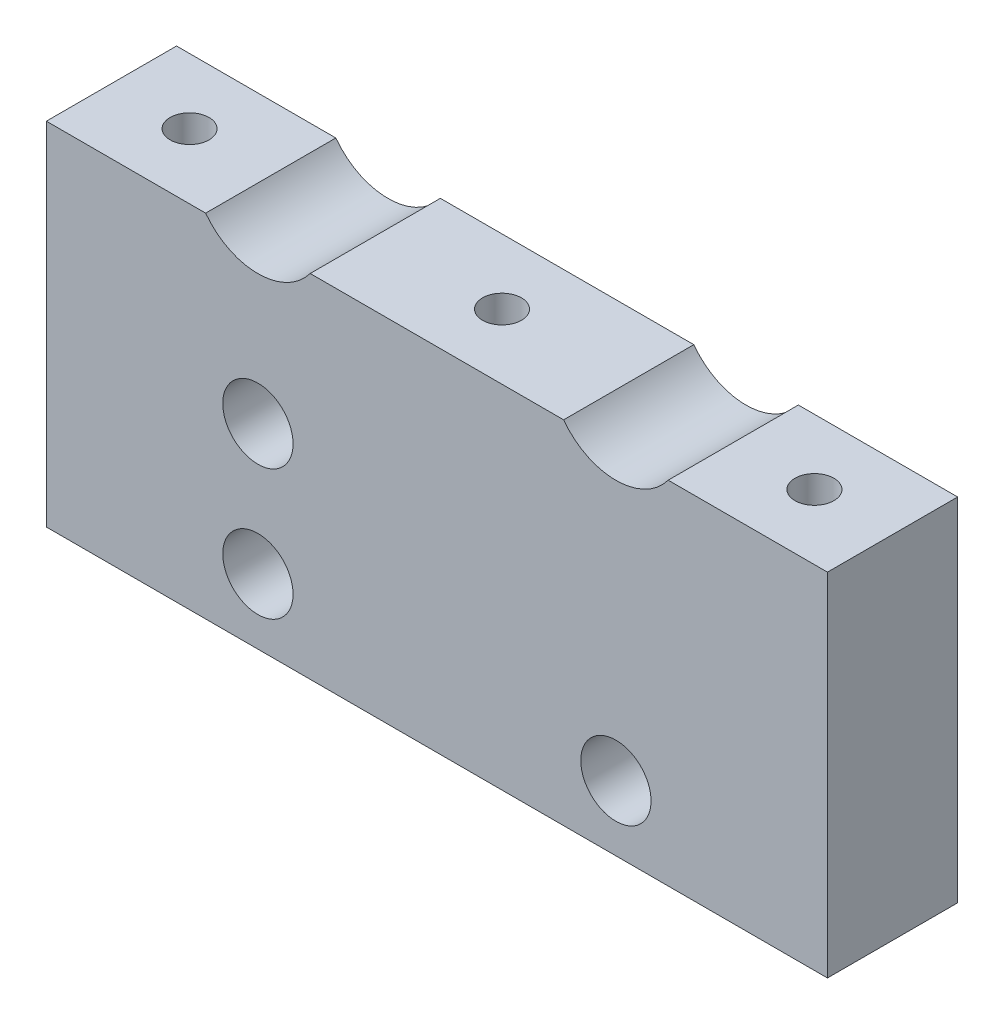
ISO-10303-21;
HEADER;
FILE_DESCRIPTION(('STEP AP214'),'2;1');
FILE_NAME('part.step','',(''),(''),'','','');
FILE_SCHEMA(('AUTOMOTIVE_DESIGN { 1 0 10303 214 1 1 1 1 }'));
ENDSEC;
DATA;
#1=APPLICATION_CONTEXT('core data for automotive mechanical design processes');
#2=APPLICATION_PROTOCOL_DEFINITION('international standard','automotive_design',2000,#1);
#3=PRODUCT_CONTEXT('',#1,'mechanical');
#4=PRODUCT('Part','Part','',(#3));
#5=PRODUCT_RELATED_PRODUCT_CATEGORY('part','',(#4));
#6=PRODUCT_DEFINITION_FORMATION('','',#4);
#7=PRODUCT_DEFINITION_CONTEXT('part definition',#1,'design');
#8=PRODUCT_DEFINITION('design','',#6,#7);
#9=PRODUCT_DEFINITION_SHAPE('','',#8);
#10=(LENGTH_UNIT() NAMED_UNIT(*) SI_UNIT(.MILLI.,.METRE.));
#11=(NAMED_UNIT(*) PLANE_ANGLE_UNIT() SI_UNIT($,.RADIAN.));
#12=(NAMED_UNIT(*) SI_UNIT($,.STERADIAN.) SOLID_ANGLE_UNIT());
#13=UNCERTAINTY_MEASURE_WITH_UNIT(LENGTH_MEASURE(1.E-05),#10,'distance_accuracy_value','');
#14=(GEOMETRIC_REPRESENTATION_CONTEXT(3) GLOBAL_UNCERTAINTY_ASSIGNED_CONTEXT((#13)) GLOBAL_UNIT_ASSIGNED_CONTEXT((#10,
#11,#12)) REPRESENTATION_CONTEXT('',''));
#15=CARTESIAN_POINT('',(0.,0.,0.));
#16=DIRECTION('',(0.,0.,1.));
#17=DIRECTION('',(1.,0.,0.));
#18=AXIS2_PLACEMENT_3D('',#15,#16,#17);
#19=CARTESIAN_POINT('',(-17.4625,20.9296,12.7));
#20=DIRECTION('',(0.,0.,1.));
#21=DIRECTION('',(1.,0.,0.));
#22=AXIS2_PLACEMENT_3D('',#19,#20,#21);
#23=PLANE('',#22);
#24=CARTESIAN_POINT('',(17.4625,-10.795,12.7));
#25=DIRECTION('',(0.,0.,1.));
#26=DIRECTION('',(-1.,0.,0.));
#27=AXIS2_PLACEMENT_3D('',#24,#25,#26);
#28=CIRCLE('',#27,3.429);
#29=CARTESIAN_POINT('',(14.0335,-10.795,12.7));
#30=VERTEX_POINT('',#29);
#31=EDGE_CURVE('E227',#30,#30,#28,.T.);
#32=ORIENTED_EDGE('',*,*,#31,.F.);
#33=EDGE_LOOP('',(#32));
#34=FACE_BOUND('',#33,.T.);
#35=DIRECTION('',(-1.,0.,0.));
#36=VECTOR('',#35,1.);
#37=CARTESIAN_POINT('',(22.5614511509721,17.145,12.7));
#38=LINE('',#37,#36);
#39=CARTESIAN_POINT('',(38.1,17.145,12.7));
#40=VERTEX_POINT('',#39);
#41=CARTESIAN_POINT('',(22.5614511509721,17.145,12.7));
#42=VERTEX_POINT('',#41);
#43=EDGE_CURVE('E178',#40,#42,#38,.T.);
#44=ORIENTED_EDGE('',*,*,#43,.T.);
#45=CARTESIAN_POINT('',(17.4625,20.9296,12.7));
#46=DIRECTION('',(0.,0.,-1.));
#47=DIRECTION('',(-1.,0.,0.));
#48=AXIS2_PLACEMENT_3D('',#45,#46,#47);
#49=CIRCLE('',#48,6.35);
#50=CARTESIAN_POINT('',(12.3635488490279,17.145,12.7));
#51=VERTEX_POINT('',#50);
#52=EDGE_CURVE('E112',#42,#51,#49,.T.);
#53=ORIENTED_EDGE('',*,*,#52,.T.);
#54=DIRECTION('',(-1.,0.,0.));
#55=VECTOR('',#54,1.);
#56=CARTESIAN_POINT('',(-12.3635488490279,17.145,12.7));
#57=LINE('',#56,#55);
#58=CARTESIAN_POINT('',(-12.3635488490279,17.145,12.7));
#59=VERTEX_POINT('',#58);
#60=EDGE_CURVE('E199',#51,#59,#57,.T.);
#61=ORIENTED_EDGE('',*,*,#60,.T.);
#62=CARTESIAN_POINT('',(-17.4625,20.9296,12.7));
#63=DIRECTION('',(0.,0.,-1.));
#64=DIRECTION('',(1.,0.,0.));
#65=AXIS2_PLACEMENT_3D('',#62,#63,#64);
#66=CIRCLE('',#65,6.35);
#67=CARTESIAN_POINT('',(-22.5614511509721,17.145,12.7));
#68=VERTEX_POINT('',#67);
#69=EDGE_CURVE('E213',#59,#68,#66,.T.);
#70=ORIENTED_EDGE('',*,*,#69,.T.);
#71=DIRECTION('',(-1.,0.,0.));
#72=VECTOR('',#71,1.);
#73=CARTESIAN_POINT('',(-38.1,17.145,12.7));
#74=LINE('',#73,#72);
#75=CARTESIAN_POINT('',(-38.1,17.145,12.7));
#76=VERTEX_POINT('',#75);
#77=EDGE_CURVE('E133',#68,#76,#74,.T.);
#78=ORIENTED_EDGE('',*,*,#77,.T.);
#79=DIRECTION('',(0.,-1.,0.));
#80=VECTOR('',#79,1.);
#81=CARTESIAN_POINT('',(-38.1,-17.145,12.7));
#82=LINE('',#81,#80);
#83=CARTESIAN_POINT('',(-38.1,-17.145,12.7));
#84=VERTEX_POINT('',#83);
#85=EDGE_CURVE('E127',#76,#84,#82,.T.);
#86=ORIENTED_EDGE('',*,*,#85,.T.);
#87=DIRECTION('',(1.,0.,0.));
#88=VECTOR('',#87,1.);
#89=CARTESIAN_POINT('',(-38.1,-17.145,12.7));
#90=LINE('',#89,#88);
#91=CARTESIAN_POINT('',(38.1,-17.145,12.7));
#92=VERTEX_POINT('',#91);
#93=EDGE_CURVE('E131',#84,#92,#90,.T.);
#94=ORIENTED_EDGE('',*,*,#93,.T.);
#95=DIRECTION('',(0.,1.,0.));
#96=VECTOR('',#95,1.);
#97=CARTESIAN_POINT('',(38.1,-17.145,12.7));
#98=LINE('',#97,#96);
#99=EDGE_CURVE('E68',#92,#40,#98,.T.);
#100=ORIENTED_EDGE('',*,*,#99,.T.);
#101=EDGE_LOOP('',(#44,#53,#61,#70,#78,#86,#94,#100));
#102=FACE_BOUND('',#101,.T.);
#103=CARTESIAN_POINT('',(-17.4625,-10.795,12.7));
#104=DIRECTION('',(0.,0.,1.));
#105=DIRECTION('',(1.,0.,0.));
#106=AXIS2_PLACEMENT_3D('',#103,#104,#105);
#107=CIRCLE('',#106,3.429);
#108=CARTESIAN_POINT('',(-14.0335,-10.795,12.7));
#109=VERTEX_POINT('',#108);
#110=EDGE_CURVE('E160',#109,#109,#107,.T.);
#111=ORIENTED_EDGE('',*,*,#110,.F.);
#112=EDGE_LOOP('',(#111));
#113=FACE_BOUND('',#112,.T.);
#114=CARTESIAN_POINT('',(-17.4625,1.905,12.7));
#115=DIRECTION('',(0.,0.,1.));
#116=DIRECTION('',(1.,0.,0.));
#117=AXIS2_PLACEMENT_3D('',#114,#115,#116);
#118=CIRCLE('',#117,3.429);
#119=CARTESIAN_POINT('',(-14.0335,1.905,12.7));
#120=VERTEX_POINT('',#119);
#121=EDGE_CURVE('E235',#120,#120,#118,.T.);
#122=ORIENTED_EDGE('',*,*,#121,.F.);
#123=EDGE_LOOP('',(#122));
#124=FACE_BOUND('',#123,.T.);
#125=ADVANCED_FACE('F50',(#34,#102,#113,#124),#23,.T.);
#126=CARTESIAN_POINT('',(-17.4625,20.9296,0.));
#127=DIRECTION('',(0.,0.,1.));
#128=DIRECTION('',(1.,0.,0.));
#129=AXIS2_PLACEMENT_3D('',#126,#127,#128);
#130=PLANE('',#129);
#131=DIRECTION('',(-1.,0.,0.));
#132=VECTOR('',#131,1.);
#133=CARTESIAN_POINT('',(22.5614511509721,17.145,0.));
#134=LINE('',#133,#132);
#135=CARTESIAN_POINT('',(38.1,17.145,0.));
#136=VERTEX_POINT('',#135);
#137=CARTESIAN_POINT('',(22.5614511509721,17.145,0.));
#138=VERTEX_POINT('',#137);
#139=EDGE_CURVE('E155',#136,#138,#134,.T.);
#140=ORIENTED_EDGE('',*,*,#139,.F.);
#141=DIRECTION('',(0.,1.,0.));
#142=VECTOR('',#141,1.);
#143=CARTESIAN_POINT('',(38.1,-17.145,0.));
#144=LINE('',#143,#142);
#145=CARTESIAN_POINT('',(38.1,-17.145,0.));
#146=VERTEX_POINT('',#145);
#147=EDGE_CURVE('E104',#146,#136,#144,.T.);
#148=ORIENTED_EDGE('',*,*,#147,.F.);
#149=DIRECTION('',(1.,0.,0.));
#150=VECTOR('',#149,1.);
#151=CARTESIAN_POINT('',(-38.1,-17.145,0.));
#152=LINE('',#151,#150);
#153=CARTESIAN_POINT('',(-38.1,-17.145,0.));
#154=VERTEX_POINT('',#153);
#155=EDGE_CURVE('E98',#154,#146,#152,.T.);
#156=ORIENTED_EDGE('',*,*,#155,.F.);
#157=DIRECTION('',(0.,-1.,0.));
#158=VECTOR('',#157,1.);
#159=CARTESIAN_POINT('',(-38.1,-17.145,0.));
#160=LINE('',#159,#158);
#161=CARTESIAN_POINT('',(-38.1,17.145,0.));
#162=VERTEX_POINT('',#161);
#163=EDGE_CURVE('E142',#162,#154,#160,.T.);
#164=ORIENTED_EDGE('',*,*,#163,.F.);
#165=DIRECTION('',(-1.,0.,0.));
#166=VECTOR('',#165,1.);
#167=CARTESIAN_POINT('',(-38.1,17.145,0.));
#168=LINE('',#167,#166);
#169=CARTESIAN_POINT('',(-22.5614511509721,17.145,0.));
#170=VERTEX_POINT('',#169);
#171=EDGE_CURVE('E169',#170,#162,#168,.T.);
#172=ORIENTED_EDGE('',*,*,#171,.F.);
#173=CARTESIAN_POINT('',(-17.4625,20.9296,0.));
#174=DIRECTION('',(0.,0.,-1.));
#175=DIRECTION('',(1.,0.,0.));
#176=AXIS2_PLACEMENT_3D('',#173,#174,#175);
#177=CIRCLE('',#176,6.35);
#178=CARTESIAN_POINT('',(-12.3635488490279,17.145,0.));
#179=VERTEX_POINT('',#178);
#180=EDGE_CURVE('E166',#179,#170,#177,.T.);
#181=ORIENTED_EDGE('',*,*,#180,.F.);
#182=DIRECTION('',(-1.,0.,0.));
#183=VECTOR('',#182,1.);
#184=CARTESIAN_POINT('',(-12.3635488490279,17.145,0.));
#185=LINE('',#184,#183);
#186=CARTESIAN_POINT('',(12.3635488490279,17.145,0.));
#187=VERTEX_POINT('',#186);
#188=EDGE_CURVE('E163',#187,#179,#185,.T.);
#189=ORIENTED_EDGE('',*,*,#188,.F.);
#190=CARTESIAN_POINT('',(17.4625,20.9296,0.));
#191=DIRECTION('',(0.,0.,-1.));
#192=DIRECTION('',(-1.,0.,0.));
#193=AXIS2_PLACEMENT_3D('',#190,#191,#192);
#194=CIRCLE('',#193,6.35);
#195=EDGE_CURVE('E159',#138,#187,#194,.T.);
#196=ORIENTED_EDGE('',*,*,#195,.F.);
#197=EDGE_LOOP('',(#140,#148,#156,#164,#172,#181,#189,#196));
#198=FACE_BOUND('',#197,.T.);
#199=CARTESIAN_POINT('',(-17.4625,-10.795,0.));
#200=DIRECTION('',(0.,0.,1.));
#201=DIRECTION('',(1.,0.,0.));
#202=AXIS2_PLACEMENT_3D('',#199,#200,#201);
#203=CIRCLE('',#202,3.429);
#204=CARTESIAN_POINT('',(-14.0335,-10.795,0.));
#205=VERTEX_POINT('',#204);
#206=EDGE_CURVE('E223',#205,#205,#203,.T.);
#207=ORIENTED_EDGE('',*,*,#206,.T.);
#208=EDGE_LOOP('',(#207));
#209=FACE_BOUND('',#208,.T.);
#210=CARTESIAN_POINT('',(17.4625,-10.795,0.));
#211=DIRECTION('',(0.,0.,1.));
#212=DIRECTION('',(-1.,0.,0.));
#213=AXIS2_PLACEMENT_3D('',#210,#211,#212);
#214=CIRCLE('',#213,3.429);
#215=CARTESIAN_POINT('',(14.0335,-10.795,0.));
#216=VERTEX_POINT('',#215);
#217=EDGE_CURVE('E231',#216,#216,#214,.T.);
#218=ORIENTED_EDGE('',*,*,#217,.T.);
#219=EDGE_LOOP('',(#218));
#220=FACE_BOUND('',#219,.T.);
#221=CARTESIAN_POINT('',(-17.4625,1.905,0.));
#222=DIRECTION('',(0.,0.,1.));
#223=DIRECTION('',(1.,0.,0.));
#224=AXIS2_PLACEMENT_3D('',#221,#222,#223);
#225=CIRCLE('',#224,3.429);
#226=CARTESIAN_POINT('',(-14.0335,1.905,0.));
#227=VERTEX_POINT('',#226);
#228=EDGE_CURVE('E239',#227,#227,#225,.T.);
#229=ORIENTED_EDGE('',*,*,#228,.T.);
#230=EDGE_LOOP('',(#229));
#231=FACE_BOUND('',#230,.T.);
#232=ADVANCED_FACE('F203',(#198,#209,#220,#231),#130,.F.);
#233=CARTESIAN_POINT('',(22.5614511509721,17.145,12.7));
#234=DIRECTION('',(0.,-1.,0.));
#235=DIRECTION('',(0.,0.,-1.));
#236=AXIS2_PLACEMENT_3D('',#233,#234,#235);
#237=PLANE('',#236);
#238=CARTESIAN_POINT('',(30.48,17.145,6.35000000000001));
#239=DIRECTION('',(0.,1.,0.));
#240=DIRECTION('',(0.,0.,1.));
#241=AXIS2_PLACEMENT_3D('',#238,#239,#240);
#242=CIRCLE('',#241,1.89864999999999);
#243=CARTESIAN_POINT('',(30.48,17.145,8.24865));
#244=VERTEX_POINT('',#243);
#245=EDGE_CURVE('E250',#244,#244,#242,.T.);
#246=ORIENTED_EDGE('',*,*,#245,.F.);
#247=EDGE_LOOP('',(#246));
#248=FACE_BOUND('',#247,.T.);
#249=ORIENTED_EDGE('',*,*,#139,.T.);
#250=DIRECTION('',(0.,0.,-1.));
#251=VECTOR('',#250,1.);
#252=CARTESIAN_POINT('',(22.5614511509721,17.145,12.7));
#253=LINE('',#252,#251);
#254=EDGE_CURVE('E11',#42,#138,#253,.T.);
#255=ORIENTED_EDGE('',*,*,#254,.F.);
#256=ORIENTED_EDGE('',*,*,#43,.F.);
#257=DIRECTION('',(0.,0.,-1.));
#258=VECTOR('',#257,1.);
#259=CARTESIAN_POINT('',(38.1,17.145,12.7));
#260=LINE('',#259,#258);
#261=EDGE_CURVE('E151',#40,#136,#260,.T.);
#262=ORIENTED_EDGE('',*,*,#261,.T.);
#263=EDGE_LOOP('',(#249,#255,#256,#262));
#264=FACE_BOUND('',#263,.T.);
#265=ADVANCED_FACE('F52',(#248,#264),#237,.F.);
#266=CARTESIAN_POINT('',(17.4625,20.9296,12.7));
#267=DIRECTION('',(0.,0.,-1.));
#268=DIRECTION('',(-1.,0.,0.));
#269=AXIS2_PLACEMENT_3D('',#266,#267,#268);
#270=CYLINDRICAL_SURFACE('',#269,6.35);
#271=ORIENTED_EDGE('',*,*,#195,.T.);
#272=DIRECTION('',(0.,0.,-1.));
#273=VECTOR('',#272,1.);
#274=CARTESIAN_POINT('',(12.3635488490279,17.145,12.7));
#275=LINE('',#274,#273);
#276=EDGE_CURVE('E60',#51,#187,#275,.T.);
#277=ORIENTED_EDGE('',*,*,#276,.F.);
#278=ORIENTED_EDGE('',*,*,#52,.F.);
#279=ORIENTED_EDGE('',*,*,#254,.T.);
#280=EDGE_LOOP('',(#271,#277,#278,#279));
#281=FACE_BOUND('',#280,.T.);
#282=ADVANCED_FACE('F340',(#281),#270,.F.);
#283=CARTESIAN_POINT('',(-12.3635488490279,17.145,12.7));
#284=DIRECTION('',(0.,-1.,0.));
#285=DIRECTION('',(0.,0.,-1.));
#286=AXIS2_PLACEMENT_3D('',#283,#284,#285);
#287=PLANE('',#286);
#288=CARTESIAN_POINT('',(0.,17.145,6.35));
#289=DIRECTION('',(0.,1.,0.));
#290=DIRECTION('',(0.,0.,1.));
#291=AXIS2_PLACEMENT_3D('',#288,#289,#290);
#292=CIRCLE('',#291,1.89864999999999);
#293=CARTESIAN_POINT('',(0.,17.145,8.24864999999999));
#294=VERTEX_POINT('',#293);
#295=EDGE_CURVE('E258',#294,#294,#292,.T.);
#296=ORIENTED_EDGE('',*,*,#295,.F.);
#297=EDGE_LOOP('',(#296));
#298=FACE_BOUND('',#297,.T.);
#299=ORIENTED_EDGE('',*,*,#188,.T.);
#300=DIRECTION('',(0.,0.,-1.));
#301=VECTOR('',#300,1.);
#302=CARTESIAN_POINT('',(-12.3635488490279,17.145,12.7));
#303=LINE('',#302,#301);
#304=EDGE_CURVE('E189',#59,#179,#303,.T.);
#305=ORIENTED_EDGE('',*,*,#304,.F.);
#306=ORIENTED_EDGE('',*,*,#60,.F.);
#307=ORIENTED_EDGE('',*,*,#276,.T.);
#308=EDGE_LOOP('',(#299,#305,#306,#307));
#309=FACE_BOUND('',#308,.T.);
#310=ADVANCED_FACE('F197',(#298,#309),#287,.F.);
#311=CARTESIAN_POINT('',(-17.4625,20.9296,12.7));
#312=DIRECTION('',(0.,0.,-1.));
#313=DIRECTION('',(-1.,0.,0.));
#314=AXIS2_PLACEMENT_3D('',#311,#312,#313);
#315=CYLINDRICAL_SURFACE('',#314,6.35);
#316=ORIENTED_EDGE('',*,*,#180,.T.);
#317=DIRECTION('',(0.,0.,-1.));
#318=VECTOR('',#317,1.);
#319=CARTESIAN_POINT('',(-22.5614511509721,17.145,12.7));
#320=LINE('',#319,#318);
#321=EDGE_CURVE('E185',#68,#170,#320,.T.);
#322=ORIENTED_EDGE('',*,*,#321,.F.);
#323=ORIENTED_EDGE('',*,*,#69,.F.);
#324=ORIENTED_EDGE('',*,*,#304,.T.);
#325=EDGE_LOOP('',(#316,#322,#323,#324));
#326=FACE_BOUND('',#325,.T.);
#327=ADVANCED_FACE('F208',(#326),#315,.F.);
#328=CARTESIAN_POINT('',(-38.1,17.145,12.7));
#329=DIRECTION('',(0.,-1.,0.));
#330=DIRECTION('',(0.,0.,-1.));
#331=AXIS2_PLACEMENT_3D('',#328,#329,#330);
#332=PLANE('',#331);
#333=CARTESIAN_POINT('',(-30.48,17.145,6.35000000000001));
#334=DIRECTION('',(0.,1.,0.));
#335=DIRECTION('',(0.,0.,1.));
#336=AXIS2_PLACEMENT_3D('',#333,#334,#335);
#337=CIRCLE('',#336,1.89864999999999);
#338=CARTESIAN_POINT('',(-30.48,17.145,8.24865));
#339=VERTEX_POINT('',#338);
#340=EDGE_CURVE('E266',#339,#339,#337,.T.);
#341=ORIENTED_EDGE('',*,*,#340,.F.);
#342=EDGE_LOOP('',(#341));
#343=FACE_BOUND('',#342,.T.);
#344=ORIENTED_EDGE('',*,*,#171,.T.);
#345=DIRECTION('',(0.,0.,-1.));
#346=VECTOR('',#345,1.);
#347=CARTESIAN_POINT('',(-38.1,17.145,12.7));
#348=LINE('',#347,#346);
#349=EDGE_CURVE('E144',#76,#162,#348,.T.);
#350=ORIENTED_EDGE('',*,*,#349,.F.);
#351=ORIENTED_EDGE('',*,*,#77,.F.);
#352=ORIENTED_EDGE('',*,*,#321,.T.);
#353=EDGE_LOOP('',(#344,#350,#351,#352));
#354=FACE_BOUND('',#353,.T.);
#355=ADVANCED_FACE('F211',(#343,#354),#332,.F.);
#356=CARTESIAN_POINT('',(-38.1,-17.145,12.7));
#357=DIRECTION('',(1.,0.,0.));
#358=DIRECTION('',(0.,0.,-1.));
#359=AXIS2_PLACEMENT_3D('',#356,#357,#358);
#360=PLANE('',#359);
#361=ORIENTED_EDGE('',*,*,#163,.T.);
#362=DIRECTION('',(0.,0.,-1.));
#363=VECTOR('',#362,1.);
#364=CARTESIAN_POINT('',(-38.1,-17.145,12.7));
#365=LINE('',#364,#363);
#366=EDGE_CURVE('E139',#84,#154,#365,.T.);
#367=ORIENTED_EDGE('',*,*,#366,.F.);
#368=ORIENTED_EDGE('',*,*,#85,.F.);
#369=ORIENTED_EDGE('',*,*,#349,.T.);
#370=EDGE_LOOP('',(#361,#367,#368,#369));
#371=FACE_BOUND('',#370,.T.);
#372=ADVANCED_FACE('F140',(#371),#360,.F.);
#373=CARTESIAN_POINT('',(-38.1,-17.145,12.7));
#374=DIRECTION('',(0.,1.,0.));
#375=DIRECTION('',(0.,0.,1.));
#376=AXIS2_PLACEMENT_3D('',#373,#374,#375);
#377=PLANE('',#376);
#378=ORIENTED_EDGE('',*,*,#155,.T.);
#379=DIRECTION('',(0.,0.,-1.));
#380=VECTOR('',#379,1.);
#381=CARTESIAN_POINT('',(38.1,-17.145,12.7));
#382=LINE('',#381,#380);
#383=EDGE_CURVE('E145',#92,#146,#382,.T.);
#384=ORIENTED_EDGE('',*,*,#383,.F.);
#385=ORIENTED_EDGE('',*,*,#93,.F.);
#386=ORIENTED_EDGE('',*,*,#366,.T.);
#387=EDGE_LOOP('',(#378,#384,#385,#386));
#388=FACE_BOUND('',#387,.T.);
#389=ADVANCED_FACE('F147',(#388),#377,.F.);
#390=CARTESIAN_POINT('',(38.1,-17.145,12.7));
#391=DIRECTION('',(-1.,0.,0.));
#392=DIRECTION('',(0.,0.,1.));
#393=AXIS2_PLACEMENT_3D('',#390,#391,#392);
#394=PLANE('',#393);
#395=ORIENTED_EDGE('',*,*,#147,.T.);
#396=ORIENTED_EDGE('',*,*,#261,.F.);
#397=ORIENTED_EDGE('',*,*,#99,.F.);
#398=ORIENTED_EDGE('',*,*,#383,.T.);
#399=EDGE_LOOP('',(#395,#396,#397,#398));
#400=FACE_BOUND('',#399,.T.);
#401=ADVANCED_FACE('F293',(#400),#394,.F.);
#402=CARTESIAN_POINT('',(-17.4625,-10.795,12.7));
#403=DIRECTION('',(0.,0.,-1.));
#404=DIRECTION('',(-1.,0.,0.));
#405=AXIS2_PLACEMENT_3D('',#402,#403,#404);
#406=CYLINDRICAL_SURFACE('',#405,3.429);
#407=ORIENTED_EDGE('',*,*,#110,.T.);
#408=EDGE_LOOP('',(#407));
#409=FACE_BOUND('',#408,.T.);
#410=ORIENTED_EDGE('',*,*,#206,.F.);
#411=EDGE_LOOP('',(#410));
#412=FACE_BOUND('',#411,.T.);
#413=ADVANCED_FACE('F290',(#409,#412),#406,.F.);
#414=CARTESIAN_POINT('',(17.4625,-10.795,12.7));
#415=DIRECTION('',(0.,0.,-1.));
#416=DIRECTION('',(-1.,0.,0.));
#417=AXIS2_PLACEMENT_3D('',#414,#415,#416);
#418=CYLINDRICAL_SURFACE('',#417,3.429);
#419=ORIENTED_EDGE('',*,*,#31,.T.);
#420=EDGE_LOOP('',(#419));
#421=FACE_BOUND('',#420,.T.);
#422=ORIENTED_EDGE('',*,*,#217,.F.);
#423=EDGE_LOOP('',(#422));
#424=FACE_BOUND('',#423,.T.);
#425=ADVANCED_FACE('F313',(#421,#424),#418,.F.);
#426=CARTESIAN_POINT('',(-17.4625,1.905,12.7));
#427=DIRECTION('',(0.,0.,-1.));
#428=DIRECTION('',(-1.,0.,0.));
#429=AXIS2_PLACEMENT_3D('',#426,#427,#428);
#430=CYLINDRICAL_SURFACE('',#429,3.429);
#431=ORIENTED_EDGE('',*,*,#121,.T.);
#432=EDGE_LOOP('',(#431));
#433=FACE_BOUND('',#432,.T.);
#434=ORIENTED_EDGE('',*,*,#228,.F.);
#435=EDGE_LOOP('',(#434));
#436=FACE_BOUND('',#435,.T.);
#437=ADVANCED_FACE('F321',(#433,#436),#430,.F.);
#438=CARTESIAN_POINT('',(30.48,-1.90499999999999,6.35000000000001));
#439=DIRECTION('',(0.,1.,0.));
#440=DIRECTION('',(0.,0.,1.));
#441=AXIS2_PLACEMENT_3D('',#438,#439,#440);
#442=CONICAL_SURFACE('',#441,1.89864999999999,1.02974425867665);
#443=CARTESIAN_POINT('',(30.48,-3.04582401431667,6.35000000000001));
#444=VERTEX_POINT('',#443);
#445=VERTEX_LOOP('',#444);
#446=FACE_BOUND('',#445,.T.);
#447=CARTESIAN_POINT('',(30.48,-1.90499999999999,6.35000000000001));
#448=DIRECTION('',(0.,1.,0.));
#449=DIRECTION('',(0.,0.,1.));
#450=AXIS2_PLACEMENT_3D('',#447,#448,#449);
#451=CIRCLE('',#450,1.89864999999999);
#452=CARTESIAN_POINT('',(30.48,-1.90499999999999,8.24865));
#453=VERTEX_POINT('',#452);
#454=EDGE_CURVE('E243',#453,#453,#451,.T.);
#455=ORIENTED_EDGE('',*,*,#454,.T.);
#456=EDGE_LOOP('',(#455));
#457=FACE_BOUND('',#456,.T.);
#458=ADVANCED_FACE('F329',(#446,#457),#442,.F.);
#459=CARTESIAN_POINT('',(30.48,17.145,6.35000000000001));
#460=DIRECTION('',(0.,1.,0.));
#461=DIRECTION('',(0.,0.,1.));
#462=AXIS2_PLACEMENT_3D('',#459,#460,#461);
#463=CYLINDRICAL_SURFACE('',#462,1.89864999999999);
#464=ORIENTED_EDGE('',*,*,#454,.F.);
#465=EDGE_LOOP('',(#464));
#466=FACE_BOUND('',#465,.T.);
#467=ORIENTED_EDGE('',*,*,#245,.T.);
#468=EDGE_LOOP('',(#467));
#469=FACE_BOUND('',#468,.T.);
#470=ADVANCED_FACE('F372',(#466,#469),#463,.F.);
#471=CARTESIAN_POINT('',(0.,-1.90499999999999,6.35));
#472=DIRECTION('',(0.,1.,0.));
#473=DIRECTION('',(0.,0.,1.));
#474=AXIS2_PLACEMENT_3D('',#471,#472,#473);
#475=CONICAL_SURFACE('',#474,1.89864999999999,1.02974425867665);
#476=CARTESIAN_POINT('',(0.,-3.04582401431667,6.35));
#477=VERTEX_POINT('',#476);
#478=VERTEX_LOOP('',#477);
#479=FACE_BOUND('',#478,.T.);
#480=CARTESIAN_POINT('',(0.,-1.90499999999999,6.35));
#481=DIRECTION('',(0.,1.,0.));
#482=DIRECTION('',(0.,0.,1.));
#483=AXIS2_PLACEMENT_3D('',#480,#481,#482);
#484=CIRCLE('',#483,1.89864999999999);
#485=CARTESIAN_POINT('',(0.,-1.90499999999999,8.24864999999999));
#486=VERTEX_POINT('',#485);
#487=EDGE_CURVE('E254',#486,#486,#484,.T.);
#488=ORIENTED_EDGE('',*,*,#487,.T.);
#489=EDGE_LOOP('',(#488));
#490=FACE_BOUND('',#489,.T.);
#491=ADVANCED_FACE('F382',(#479,#490),#475,.F.);
#492=CARTESIAN_POINT('',(0.,17.145,6.35));
#493=DIRECTION('',(0.,1.,0.));
#494=DIRECTION('',(0.,0.,1.));
#495=AXIS2_PLACEMENT_3D('',#492,#493,#494);
#496=CYLINDRICAL_SURFACE('',#495,1.89864999999999);
#497=ORIENTED_EDGE('',*,*,#487,.F.);
#498=EDGE_LOOP('',(#497));
#499=FACE_BOUND('',#498,.T.);
#500=ORIENTED_EDGE('',*,*,#295,.T.);
#501=EDGE_LOOP('',(#500));
#502=FACE_BOUND('',#501,.T.);
#503=ADVANCED_FACE('F393',(#499,#502),#496,.F.);
#504=CARTESIAN_POINT('',(-30.48,-1.90499999999999,6.35000000000001));
#505=DIRECTION('',(0.,1.,0.));
#506=DIRECTION('',(0.,0.,1.));
#507=AXIS2_PLACEMENT_3D('',#504,#505,#506);
#508=CONICAL_SURFACE('',#507,1.89864999999999,1.02974425867665);
#509=CARTESIAN_POINT('',(-30.48,-3.04582401431667,6.35000000000001));
#510=VERTEX_POINT('',#509);
#511=VERTEX_LOOP('',#510);
#512=FACE_BOUND('',#511,.T.);
#513=CARTESIAN_POINT('',(-30.48,-1.90499999999999,6.35000000000001));
#514=DIRECTION('',(0.,1.,0.));
#515=DIRECTION('',(0.,0.,1.));
#516=AXIS2_PLACEMENT_3D('',#513,#514,#515);
#517=CIRCLE('',#516,1.89864999999999);
#518=CARTESIAN_POINT('',(-30.48,-1.90499999999999,8.24865));
#519=VERTEX_POINT('',#518);
#520=EDGE_CURVE('E262',#519,#519,#517,.T.);
#521=ORIENTED_EDGE('',*,*,#520,.T.);
#522=EDGE_LOOP('',(#521));
#523=FACE_BOUND('',#522,.T.);
#524=ADVANCED_FACE('F403',(#512,#523),#508,.F.);
#525=CARTESIAN_POINT('',(-30.48,17.145,6.35000000000001));
#526=DIRECTION('',(0.,1.,0.));
#527=DIRECTION('',(0.,0.,1.));
#528=AXIS2_PLACEMENT_3D('',#525,#526,#527);
#529=CYLINDRICAL_SURFACE('',#528,1.89864999999999);
#530=ORIENTED_EDGE('',*,*,#520,.F.);
#531=EDGE_LOOP('',(#530));
#532=FACE_BOUND('',#531,.T.);
#533=ORIENTED_EDGE('',*,*,#340,.T.);
#534=EDGE_LOOP('',(#533));
#535=FACE_BOUND('',#534,.T.);
#536=ADVANCED_FACE('F271',(#532,#535),#529,.F.);
#537=CLOSED_SHELL('',(#125,#232,#265,#282,#310,#327,#355,#372,#389,#401,#413,#425,#437,#458,
#470,#491,#503,#524,#536));
#538=MANIFOLD_SOLID_BREP('B2',#537);
#539=ADVANCED_BREP_SHAPE_REPRESENTATION('',(#18,#538),#14);
#540=SHAPE_DEFINITION_REPRESENTATION(#9,#539);
ENDSEC;
END-ISO-10303-21;
